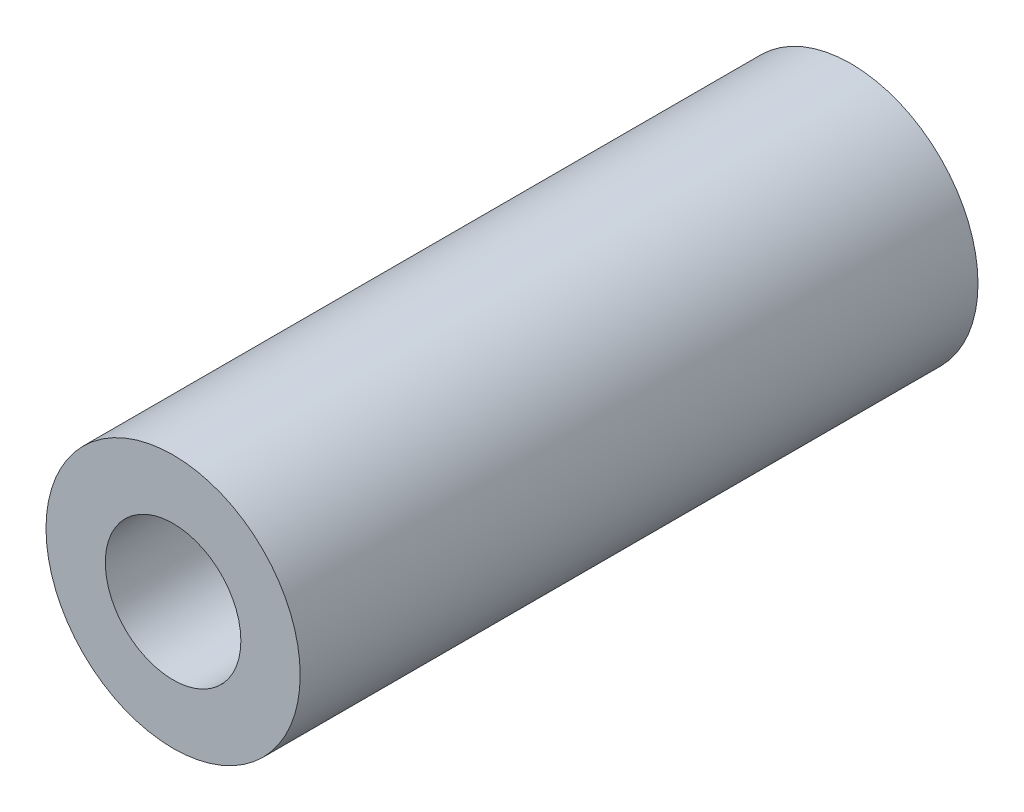
ISO-10303-21;
HEADER;
FILE_DESCRIPTION(('STEP AP214'),'2;1');
FILE_NAME('part.step','',(''),(''),'','','');
FILE_SCHEMA(('AUTOMOTIVE_DESIGN { 1 0 10303 214 1 1 1 1 }'));
ENDSEC;
DATA;
#1=APPLICATION_CONTEXT('core data for automotive mechanical design processes');
#2=APPLICATION_PROTOCOL_DEFINITION('international standard','automotive_design',2000,#1);
#3=PRODUCT_CONTEXT('',#1,'mechanical');
#4=PRODUCT('Part','Part','',(#3));
#5=PRODUCT_RELATED_PRODUCT_CATEGORY('part','',(#4));
#6=PRODUCT_DEFINITION_FORMATION('','',#4);
#7=PRODUCT_DEFINITION_CONTEXT('part definition',#1,'design');
#8=PRODUCT_DEFINITION('design','',#6,#7);
#9=PRODUCT_DEFINITION_SHAPE('','',#8);
#10=(LENGTH_UNIT() NAMED_UNIT(*) SI_UNIT(.MILLI.,.METRE.));
#11=(NAMED_UNIT(*) PLANE_ANGLE_UNIT() SI_UNIT($,.RADIAN.));
#12=(NAMED_UNIT(*) SI_UNIT($,.STERADIAN.) SOLID_ANGLE_UNIT());
#13=UNCERTAINTY_MEASURE_WITH_UNIT(LENGTH_MEASURE(1.E-05),#10,'distance_accuracy_value','');
#14=(GEOMETRIC_REPRESENTATION_CONTEXT(3) GLOBAL_UNCERTAINTY_ASSIGNED_CONTEXT((#13)) GLOBAL_UNIT_ASSIGNED_CONTEXT((#10,
#11,#12)) REPRESENTATION_CONTEXT('',''));
#15=CARTESIAN_POINT('',(0.,0.,0.));
#16=DIRECTION('',(0.,0.,1.));
#17=DIRECTION('',(1.,0.,0.));
#18=AXIS2_PLACEMENT_3D('',#15,#16,#17);
#19=CARTESIAN_POINT('',(0.,0.,16.));
#20=DIRECTION('',(0.,0.,1.));
#21=DIRECTION('',(1.,0.,0.));
#22=AXIS2_PLACEMENT_3D('',#19,#20,#21);
#23=PLANE('',#22);
#24=CARTESIAN_POINT('',(0.,0.,16.));
#25=DIRECTION('',(0.,0.,1.));
#26=DIRECTION('',(1.,0.,0.));
#27=AXIS2_PLACEMENT_3D('',#24,#25,#26);
#28=CIRCLE('',#27,3.);
#29=CARTESIAN_POINT('',(3.,0.,16.));
#30=VERTEX_POINT('',#29);
#31=EDGE_CURVE('E10',#30,#30,#28,.T.);
#32=ORIENTED_EDGE('',*,*,#31,.T.);
#33=EDGE_LOOP('',(#32));
#34=FACE_BOUND('',#33,.T.);
#35=CARTESIAN_POINT('',(0.,0.,16.));
#36=DIRECTION('',(0.,0.,1.));
#37=DIRECTION('',(1.,0.,0.));
#38=AXIS2_PLACEMENT_3D('',#35,#36,#37);
#39=CIRCLE('',#38,1.6);
#40=CARTESIAN_POINT('',(1.6,0.,16.));
#41=VERTEX_POINT('',#40);
#42=EDGE_CURVE('E42',#41,#41,#39,.T.);
#43=ORIENTED_EDGE('',*,*,#42,.F.);
#44=EDGE_LOOP('',(#43));
#45=FACE_BOUND('',#44,.T.);
#46=ADVANCED_FACE('F31',(#34,#45),#23,.T.);
#47=CARTESIAN_POINT('',(0.,0.,0.));
#48=DIRECTION('',(0.,0.,1.));
#49=DIRECTION('',(1.,0.,0.));
#50=AXIS2_PLACEMENT_3D('',#47,#48,#49);
#51=PLANE('',#50);
#52=CARTESIAN_POINT('',(0.,0.,0.));
#53=DIRECTION('',(0.,0.,1.));
#54=DIRECTION('',(1.,0.,0.));
#55=AXIS2_PLACEMENT_3D('',#52,#53,#54);
#56=CIRCLE('',#55,3.);
#57=CARTESIAN_POINT('',(3.,0.,0.));
#58=VERTEX_POINT('',#57);
#59=EDGE_CURVE('E35',#58,#58,#56,.T.);
#60=ORIENTED_EDGE('',*,*,#59,.F.);
#61=EDGE_LOOP('',(#60));
#62=FACE_BOUND('',#61,.T.);
#63=CARTESIAN_POINT('',(0.,0.,0.));
#64=DIRECTION('',(0.,0.,1.));
#65=DIRECTION('',(1.,0.,0.));
#66=AXIS2_PLACEMENT_3D('',#63,#64,#65);
#67=CIRCLE('',#66,1.6);
#68=CARTESIAN_POINT('',(1.6,0.,0.));
#69=VERTEX_POINT('',#68);
#70=EDGE_CURVE('E44',#69,#69,#67,.T.);
#71=ORIENTED_EDGE('',*,*,#70,.T.);
#72=EDGE_LOOP('',(#71));
#73=FACE_BOUND('',#72,.T.);
#74=ADVANCED_FACE('F54',(#62,#73),#51,.F.);
#75=CARTESIAN_POINT('',(0.,0.,16.));
#76=DIRECTION('',(0.,0.,-1.));
#77=DIRECTION('',(-1.,0.,0.));
#78=AXIS2_PLACEMENT_3D('',#75,#76,#77);
#79=CYLINDRICAL_SURFACE('',#78,3.);
#80=ORIENTED_EDGE('',*,*,#31,.F.);
#81=EDGE_LOOP('',(#80));
#82=FACE_BOUND('',#81,.T.);
#83=ORIENTED_EDGE('',*,*,#59,.T.);
#84=EDGE_LOOP('',(#83));
#85=FACE_BOUND('',#84,.T.);
#86=ADVANCED_FACE('F33',(#82,#85),#79,.T.);
#87=CARTESIAN_POINT('',(0.,0.,16.));
#88=DIRECTION('',(0.,0.,-1.));
#89=DIRECTION('',(-1.,0.,0.));
#90=AXIS2_PLACEMENT_3D('',#87,#88,#89);
#91=CYLINDRICAL_SURFACE('',#90,1.6);
#92=ORIENTED_EDGE('',*,*,#42,.T.);
#93=EDGE_LOOP('',(#92));
#94=FACE_BOUND('',#93,.T.);
#95=ORIENTED_EDGE('',*,*,#70,.F.);
#96=EDGE_LOOP('',(#95));
#97=FACE_BOUND('',#96,.T.);
#98=ADVANCED_FACE('F50',(#94,#97),#91,.F.);
#99=CLOSED_SHELL('',(#46,#74,#86,#98));
#100=MANIFOLD_SOLID_BREP('B2',#99);
#101=ADVANCED_BREP_SHAPE_REPRESENTATION('',(#18,#100),#14);
#102=SHAPE_DEFINITION_REPRESENTATION(#9,#101);
ENDSEC;
END-ISO-10303-21;
